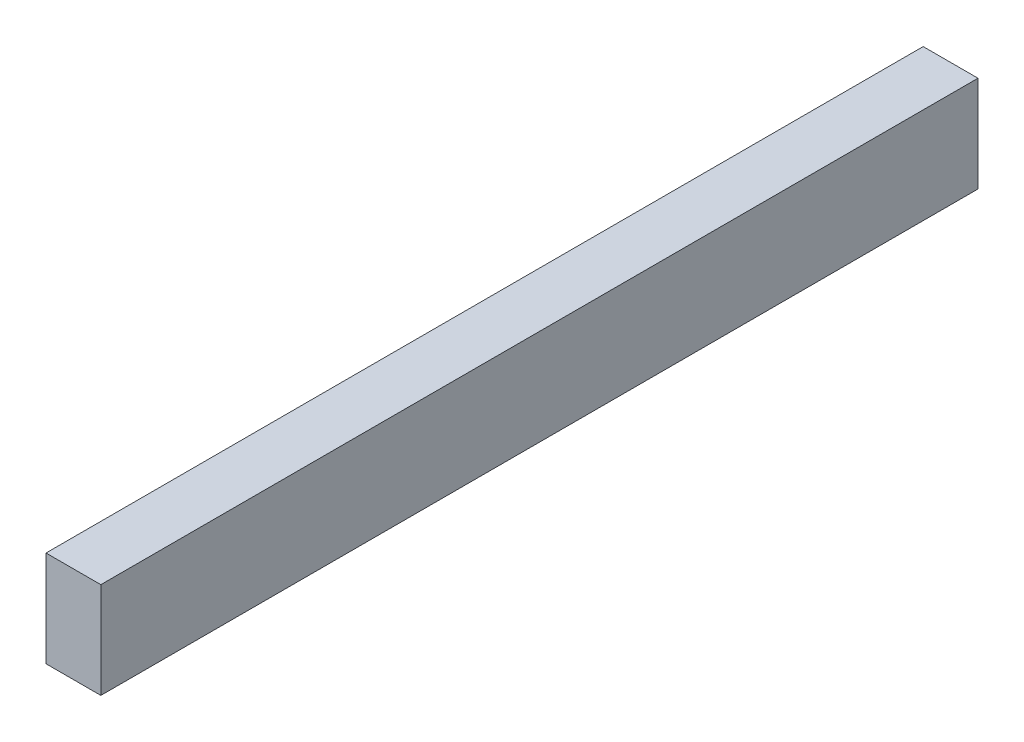
ISO-10303-21;
HEADER;
FILE_DESCRIPTION(('STEP AP214'),'2;1');
FILE_NAME('part.step','',(''),(''),'','','');
FILE_SCHEMA(('AUTOMOTIVE_DESIGN { 1 0 10303 214 1 1 1 1 }'));
ENDSEC;
DATA;
#1=APPLICATION_CONTEXT('core data for automotive mechanical design processes');
#2=APPLICATION_PROTOCOL_DEFINITION('international standard','automotive_design',2000,#1);
#3=PRODUCT_CONTEXT('',#1,'mechanical');
#4=PRODUCT('Part','Part','',(#3));
#5=PRODUCT_RELATED_PRODUCT_CATEGORY('part','',(#4));
#6=PRODUCT_DEFINITION_FORMATION('','',#4);
#7=PRODUCT_DEFINITION_CONTEXT('part definition',#1,'design');
#8=PRODUCT_DEFINITION('design','',#6,#7);
#9=PRODUCT_DEFINITION_SHAPE('','',#8);
#10=(LENGTH_UNIT() NAMED_UNIT(*) SI_UNIT(.MILLI.,.METRE.));
#11=(NAMED_UNIT(*) PLANE_ANGLE_UNIT() SI_UNIT($,.RADIAN.));
#12=(NAMED_UNIT(*) SI_UNIT($,.STERADIAN.) SOLID_ANGLE_UNIT());
#13=UNCERTAINTY_MEASURE_WITH_UNIT(LENGTH_MEASURE(1.E-05),#10,'distance_accuracy_value','');
#14=(GEOMETRIC_REPRESENTATION_CONTEXT(3) GLOBAL_UNCERTAINTY_ASSIGNED_CONTEXT((#13)) GLOBAL_UNIT_ASSIGNED_CONTEXT((#10,
#11,#12)) REPRESENTATION_CONTEXT('',''));
#15=CARTESIAN_POINT('',(0.,0.,0.));
#16=DIRECTION('',(0.,0.,1.));
#17=DIRECTION('',(1.,0.,0.));
#18=AXIS2_PLACEMENT_3D('',#15,#16,#17);
#19=CARTESIAN_POINT('',(91.6226015524661,8.5,76.));
#20=DIRECTION('',(0.,0.,1.));
#21=DIRECTION('',(1.,0.,0.));
#22=AXIS2_PLACEMENT_3D('',#19,#20,#21);
#23=PLANE('',#22);
#24=DIRECTION('',(-1.,0.,0.));
#25=VECTOR('',#24,1.);
#26=CARTESIAN_POINT('',(91.6226015524661,1.5,76.));
#27=LINE('',#26,#25);
#28=CARTESIAN_POINT('',(95.6226015524661,1.5,76.));
#29=VERTEX_POINT('',#28);
#30=CARTESIAN_POINT('',(91.6226015524661,1.5,76.));
#31=VERTEX_POINT('',#30);
#32=EDGE_CURVE('E100',#29,#31,#27,.T.);
#33=ORIENTED_EDGE('',*,*,#32,.T.);
#34=DIRECTION('',(0.,-1.,0.));
#35=VECTOR('',#34,1.);
#36=CARTESIAN_POINT('',(91.6226015524661,8.5,76.));
#37=LINE('',#36,#35);
#38=CARTESIAN_POINT('',(91.6226015524661,8.5,76.));
#39=VERTEX_POINT('',#38);
#40=EDGE_CURVE('E98',#39,#31,#37,.T.);
#41=ORIENTED_EDGE('',*,*,#40,.F.);
#42=DIRECTION('',(-1.,0.,0.));
#43=VECTOR('',#42,1.);
#44=CARTESIAN_POINT('',(91.6226015524661,8.5,76.));
#45=LINE('',#44,#43);
#46=CARTESIAN_POINT('',(95.6226015524661,8.5,76.));
#47=VERTEX_POINT('',#46);
#48=EDGE_CURVE('E61',#47,#39,#45,.T.);
#49=ORIENTED_EDGE('',*,*,#48,.F.);
#50=DIRECTION('',(0.,-1.,0.));
#51=VECTOR('',#50,1.);
#52=CARTESIAN_POINT('',(95.6226015524661,8.5,76.));
#53=LINE('',#52,#51);
#54=EDGE_CURVE('E108',#47,#29,#53,.T.);
#55=ORIENTED_EDGE('',*,*,#54,.T.);
#56=EDGE_LOOP('',(#33,#41,#49,#55));
#57=FACE_BOUND('',#56,.T.);
#58=ADVANCED_FACE('F45',(#57),#23,.F.);
#59=CARTESIAN_POINT('',(91.6226015524661,8.5,76.));
#60=DIRECTION('',(1.,0.,0.));
#61=DIRECTION('',(0.,0.,-1.));
#62=AXIS2_PLACEMENT_3D('',#59,#60,#61);
#63=PLANE('',#62);
#64=DIRECTION('',(0.,0.,1.));
#65=VECTOR('',#64,1.);
#66=CARTESIAN_POINT('',(91.6226015524661,1.5,76.));
#67=LINE('',#66,#65);
#68=CARTESIAN_POINT('',(91.6226015524661,1.5,140.));
#69=VERTEX_POINT('',#68);
#70=EDGE_CURVE('E84',#31,#69,#67,.T.);
#71=ORIENTED_EDGE('',*,*,#70,.T.);
#72=DIRECTION('',(0.,-1.,0.));
#73=VECTOR('',#72,1.);
#74=CARTESIAN_POINT('',(91.6226015524661,8.5,140.));
#75=LINE('',#74,#73);
#76=CARTESIAN_POINT('',(91.6226015524661,8.5,140.));
#77=VERTEX_POINT('',#76);
#78=EDGE_CURVE('E54',#77,#69,#75,.T.);
#79=ORIENTED_EDGE('',*,*,#78,.F.);
#80=DIRECTION('',(0.,0.,1.));
#81=VECTOR('',#80,1.);
#82=CARTESIAN_POINT('',(91.6226015524661,8.5,76.));
#83=LINE('',#82,#81);
#84=EDGE_CURVE('E106',#39,#77,#83,.T.);
#85=ORIENTED_EDGE('',*,*,#84,.F.);
#86=ORIENTED_EDGE('',*,*,#40,.T.);
#87=EDGE_LOOP('',(#71,#79,#85,#86));
#88=FACE_BOUND('',#87,.T.);
#89=ADVANCED_FACE('F97',(#88),#63,.F.);
#90=CARTESIAN_POINT('',(0.,8.5,0.));
#91=DIRECTION('',(0.,1.,0.));
#92=DIRECTION('',(0.,0.,1.));
#93=AXIS2_PLACEMENT_3D('',#90,#91,#92);
#94=PLANE('',#93);
#95=ORIENTED_EDGE('',*,*,#84,.T.);
#96=DIRECTION('',(1.,0.,0.));
#97=VECTOR('',#96,1.);
#98=CARTESIAN_POINT('',(91.6226015524661,8.5,140.));
#99=LINE('',#98,#97);
#100=CARTESIAN_POINT('',(95.6226015524662,8.5,140.));
#101=VERTEX_POINT('',#100);
#102=EDGE_CURVE('E92',#77,#101,#99,.T.);
#103=ORIENTED_EDGE('',*,*,#102,.T.);
#104=DIRECTION('',(0.,0.,-1.));
#105=VECTOR('',#104,1.);
#106=CARTESIAN_POINT('',(95.6226015524661,8.5,76.));
#107=LINE('',#106,#105);
#108=EDGE_CURVE('E115',#101,#47,#107,.T.);
#109=ORIENTED_EDGE('',*,*,#108,.T.);
#110=ORIENTED_EDGE('',*,*,#48,.T.);
#111=EDGE_LOOP('',(#95,#103,#109,#110));
#112=FACE_BOUND('',#111,.T.);
#113=ADVANCED_FACE('F118',(#112),#94,.T.);
#114=CARTESIAN_POINT('',(95.6226015524661,8.5,76.));
#115=DIRECTION('',(-1.,0.,0.));
#116=DIRECTION('',(0.,0.,1.));
#117=AXIS2_PLACEMENT_3D('',#114,#115,#116);
#118=PLANE('',#117);
#119=DIRECTION('',(0.,0.,-1.));
#120=VECTOR('',#119,1.);
#121=CARTESIAN_POINT('',(95.6226015524661,1.5,76.));
#122=LINE('',#121,#120);
#123=CARTESIAN_POINT('',(95.6226015524662,1.5,140.));
#124=VERTEX_POINT('',#123);
#125=EDGE_CURVE('E87',#124,#29,#122,.T.);
#126=ORIENTED_EDGE('',*,*,#125,.T.);
#127=ORIENTED_EDGE('',*,*,#54,.F.);
#128=ORIENTED_EDGE('',*,*,#108,.F.);
#129=DIRECTION('',(0.,-1.,0.));
#130=VECTOR('',#129,1.);
#131=CARTESIAN_POINT('',(95.6226015524662,8.5,140.));
#132=LINE('',#131,#130);
#133=EDGE_CURVE('E95',#101,#124,#132,.T.);
#134=ORIENTED_EDGE('',*,*,#133,.T.);
#135=EDGE_LOOP('',(#126,#127,#128,#134));
#136=FACE_BOUND('',#135,.T.);
#137=ADVANCED_FACE('F113',(#136),#118,.F.);
#138=CARTESIAN_POINT('',(140.,1.5,140.));
#139=DIRECTION('',(0.,0.,-1.));
#140=DIRECTION('',(-1.,0.,0.));
#141=AXIS2_PLACEMENT_3D('',#138,#139,#140);
#142=PLANE('',#141);
#143=ORIENTED_EDGE('',*,*,#78,.T.);
#144=DIRECTION('',(1.,0.,0.));
#145=VECTOR('',#144,1.);
#146=CARTESIAN_POINT('',(140.,1.5,140.));
#147=LINE('',#146,#145);
#148=EDGE_CURVE('E11',#69,#124,#147,.T.);
#149=ORIENTED_EDGE('',*,*,#148,.T.);
#150=ORIENTED_EDGE('',*,*,#133,.F.);
#151=ORIENTED_EDGE('',*,*,#102,.F.);
#152=EDGE_LOOP('',(#143,#149,#150,#151));
#153=FACE_BOUND('',#152,.T.);
#154=ADVANCED_FACE('F47',(#153),#142,.F.);
#155=CARTESIAN_POINT('',(87.7215699487633,1.5,140.));
#156=DIRECTION('',(0.,1.,0.));
#157=DIRECTION('',(0.,0.,1.));
#158=AXIS2_PLACEMENT_3D('',#155,#156,#157);
#159=PLANE('',#158);
#160=ORIENTED_EDGE('',*,*,#32,.F.);
#161=ORIENTED_EDGE('',*,*,#125,.F.);
#162=ORIENTED_EDGE('',*,*,#148,.F.);
#163=ORIENTED_EDGE('',*,*,#70,.F.);
#164=EDGE_LOOP('',(#160,#161,#162,#163));
#165=FACE_BOUND('',#164,.T.);
#166=ADVANCED_FACE('F82',(#165),#159,.F.);
#167=CLOSED_SHELL('',(#58,#89,#113,#137,#154,#166));
#168=MANIFOLD_SOLID_BREP('B2',#167);
#169=ADVANCED_BREP_SHAPE_REPRESENTATION('',(#18,#168),#14);
#170=SHAPE_DEFINITION_REPRESENTATION(#9,#169);
ENDSEC;
END-ISO-10303-21;
